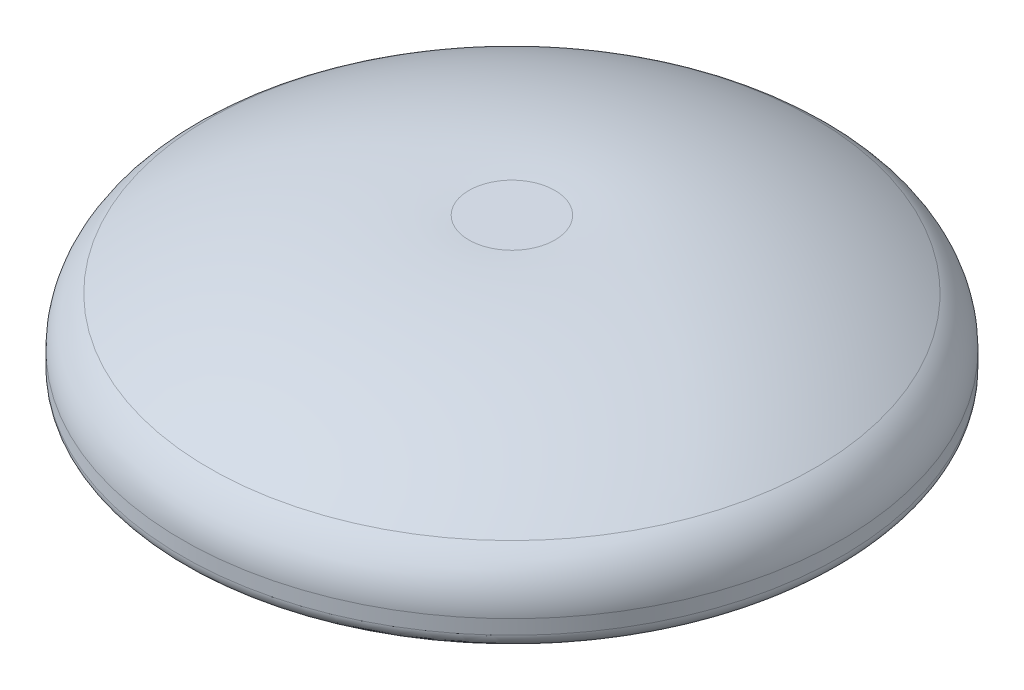
ISO-10303-21;
HEADER;
FILE_DESCRIPTION(('STEP AP214'),'2;1');
FILE_NAME('part.step','',(''),(''),'','','');
FILE_SCHEMA(('AUTOMOTIVE_DESIGN { 1 0 10303 214 1 1 1 1 }'));
ENDSEC;
DATA;
#1=APPLICATION_CONTEXT('core data for automotive mechanical design processes');
#2=APPLICATION_PROTOCOL_DEFINITION('international standard','automotive_design',2000,#1);
#3=PRODUCT_CONTEXT('',#1,'mechanical');
#4=PRODUCT('Part','Part','',(#3));
#5=PRODUCT_RELATED_PRODUCT_CATEGORY('part','',(#4));
#6=PRODUCT_DEFINITION_FORMATION('','',#4);
#7=PRODUCT_DEFINITION_CONTEXT('part definition',#1,'design');
#8=PRODUCT_DEFINITION('design','',#6,#7);
#9=PRODUCT_DEFINITION_SHAPE('','',#8);
#10=(LENGTH_UNIT() NAMED_UNIT(*) SI_UNIT(.MILLI.,.METRE.));
#11=(NAMED_UNIT(*) PLANE_ANGLE_UNIT() SI_UNIT($,.RADIAN.));
#12=(NAMED_UNIT(*) SI_UNIT($,.STERADIAN.) SOLID_ANGLE_UNIT());
#13=UNCERTAINTY_MEASURE_WITH_UNIT(LENGTH_MEASURE(1.E-05),#10,'distance_accuracy_value','');
#14=(GEOMETRIC_REPRESENTATION_CONTEXT(3) GLOBAL_UNCERTAINTY_ASSIGNED_CONTEXT((#13)) GLOBAL_UNIT_ASSIGNED_CONTEXT((#10,
#11,#12)) REPRESENTATION_CONTEXT('',''));
#15=CARTESIAN_POINT('',(0.,0.,0.));
#16=DIRECTION('',(0.,0.,1.));
#17=DIRECTION('',(1.,0.,0.));
#18=AXIS2_PLACEMENT_3D('',#15,#16,#17);
#19=CARTESIAN_POINT('',(0.,0.499985845031289,0.));
#20=DIRECTION('',(0.,-1.,0.));
#21=DIRECTION('',(0.,0.,-1.));
#22=AXIS2_PLACEMENT_3D('',#19,#20,#21);
#23=TOROIDAL_SURFACE('',#22,11.0000138738086,0.499986126383047);
#24=CARTESIAN_POINT('',(0.,-2.81351758080542E-07,0.));
#25=DIRECTION('',(0.,-1.,0.));
#26=DIRECTION('',(0.,0.,-1.));
#27=AXIS2_PLACEMENT_3D('',#24,#25,#26);
#28=CIRCLE('',#27,11.0000138738086);
#29=CARTESIAN_POINT('',(0.,-2.81351758080542E-07,-11.0000138738086));
#30=VERTEX_POINT('',#29);
#31=EDGE_CURVE('E53',#30,#30,#28,.T.);
#32=ORIENTED_EDGE('',*,*,#31,.F.);
#33=EDGE_LOOP('',(#32));
#34=FACE_BOUND('',#33,.T.);
#35=CARTESIAN_POINT('',(0.,0.499999718648242,0.));
#36=DIRECTION('',(0.,-1.,0.));
#37=DIRECTION('',(0.,0.,-1.));
#38=AXIS2_PLACEMENT_3D('',#35,#36,#37);
#39=CIRCLE('',#38,11.4999999999992);
#40=CARTESIAN_POINT('',(0.,0.499999718648242,-11.4999999999992));
#41=VERTEX_POINT('',#40);
#42=EDGE_CURVE('E65',#41,#41,#39,.T.);
#43=ORIENTED_EDGE('',*,*,#42,.T.);
#44=EDGE_LOOP('',(#43));
#45=FACE_BOUND('',#44,.T.);
#46=ADVANCED_FACE('F33',(#34,#45),#23,.T.);
#47=CARTESIAN_POINT('',(-11.0000138738086,-2.81351758080542E-07,0.));
#48=DIRECTION('',(0.,1.,0.));
#49=DIRECTION('',(0.,0.,1.));
#50=AXIS2_PLACEMENT_3D('',#47,#48,#49);
#51=PLANE('',#50);
#52=CARTESIAN_POINT('',(0.,-2.81351758080542E-07,0.));
#53=DIRECTION('',(0.,1.,0.));
#54=DIRECTION('',(0.,0.,1.));
#55=AXIS2_PLACEMENT_3D('',#52,#53,#54);
#56=CIRCLE('',#55,2.5);
#57=CARTESIAN_POINT('',(0.,-2.81351758080542E-07,2.5));
#58=VERTEX_POINT('',#57);
#59=EDGE_CURVE('E44',#58,#58,#56,.T.);
#60=ORIENTED_EDGE('',*,*,#59,.T.);
#61=EDGE_LOOP('',(#60));
#62=FACE_BOUND('',#61,.T.);
#63=ORIENTED_EDGE('',*,*,#31,.T.);
#64=EDGE_LOOP('',(#63));
#65=FACE_BOUND('',#64,.T.);
#66=ADVANCED_FACE('F99',(#62,#65),#51,.F.);
#67=CARTESIAN_POINT('',(0.,0.,0.));
#68=DIRECTION('',(0.,-1.,0.));
#69=DIRECTION('',(0.,0.,-1.));
#70=AXIS2_PLACEMENT_3D('',#67,#68,#69);
#71=CYLINDRICAL_SURFACE('',#70,1.);
#72=CARTESIAN_POINT('',(0.,-4.50000028135176,0.));
#73=DIRECTION('',(0.,1.,0.));
#74=DIRECTION('',(0.,0.,1.));
#75=AXIS2_PLACEMENT_3D('',#72,#73,#74);
#76=CIRCLE('',#75,1.);
#77=CARTESIAN_POINT('',(0.,-4.50000028135176,1.));
#78=VERTEX_POINT('',#77);
#79=EDGE_CURVE('E10',#78,#78,#76,.T.);
#80=ORIENTED_EDGE('',*,*,#79,.T.);
#81=EDGE_LOOP('',(#80));
#82=FACE_BOUND('',#81,.T.);
#83=CARTESIAN_POINT('',(0.,-1.50000028135176,0.));
#84=DIRECTION('',(0.,1.,0.));
#85=DIRECTION('',(0.,0.,1.));
#86=AXIS2_PLACEMENT_3D('',#83,#84,#85);
#87=CIRCLE('',#86,1.);
#88=CARTESIAN_POINT('',(0.,-1.50000028135176,1.));
#89=VERTEX_POINT('',#88);
#90=EDGE_CURVE('E48',#89,#89,#87,.F.);
#91=ORIENTED_EDGE('',*,*,#90,.T.);
#92=EDGE_LOOP('',(#91));
#93=FACE_BOUND('',#92,.T.);
#94=ADVANCED_FACE('F96',(#82,#93),#71,.T.);
#95=CARTESIAN_POINT('',(-0.999999999999999,-5.00000028135176,0.));
#96=DIRECTION('',(0.,1.,0.));
#97=DIRECTION('',(0.,0.,1.));
#98=AXIS2_PLACEMENT_3D('',#95,#96,#97);
#99=PLANE('',#98);
#100=CARTESIAN_POINT('',(0.,-5.00000028135176,0.));
#101=DIRECTION('',(0.,1.,0.));
#102=DIRECTION('',(0.,0.,1.));
#103=AXIS2_PLACEMENT_3D('',#100,#101,#102);
#104=CIRCLE('',#103,0.500000000000004);
#105=CARTESIAN_POINT('',(0.,-5.00000028135176,0.500000000000004));
#106=VERTEX_POINT('',#105);
#107=EDGE_CURVE('E40',#106,#106,#104,.F.);
#108=ORIENTED_EDGE('',*,*,#107,.T.);
#109=EDGE_LOOP('',(#108));
#110=FACE_BOUND('',#109,.T.);
#111=ADVANCED_FACE('F91',(#110),#99,.F.);
#112=CARTESIAN_POINT('',(-1.50000000000001,5.06243,0.));
#113=DIRECTION('',(0.,-1.,0.));
#114=DIRECTION('',(0.,0.,-1.));
#115=AXIS2_PLACEMENT_3D('',#112,#113,#114);
#116=PLANE('',#115);
#117=CARTESIAN_POINT('',(0.,5.06243,0.));
#118=DIRECTION('',(0.,-1.,0.));
#119=DIRECTION('',(0.,0.,-1.));
#120=AXIS2_PLACEMENT_3D('',#117,#118,#119);
#121=CIRCLE('',#120,1.50000000000001);
#122=CARTESIAN_POINT('',(0.,5.06243,-1.50000000000001));
#123=VERTEX_POINT('',#122);
#124=EDGE_CURVE('E56',#123,#123,#121,.T.);
#125=ORIENTED_EDGE('',*,*,#124,.F.);
#126=EDGE_LOOP('',(#125));
#127=FACE_BOUND('',#126,.T.);
#128=ADVANCED_FACE('F86',(#127),#116,.F.);
#129=CARTESIAN_POINT('',(0.,-10.4322816503441,0.));
#130=DIRECTION('',(0.,-1.,0.));
#131=DIRECTION('',(0.,0.,-1.));
#132=AXIS2_PLACEMENT_3D('',#129,#130,#131);
#133=DEGENERATE_TOROIDAL_SURFACE('',#132,2.30270713318434,15.5154899332562,.T.);
#134=CARTESIAN_POINT('',(0.,2.70028186064478,0.));
#135=DIRECTION('',(0.,-1.,0.));
#136=DIRECTION('',(0.,0.,-1.));
#137=AXIS2_PLACEMENT_3D('',#134,#135,#136);
#138=CIRCLE('',#137,10.5650435762746);
#139=CARTESIAN_POINT('',(0.,2.70028186064478,-10.5650435762746));
#140=VERTEX_POINT('',#139);
#141=EDGE_CURVE('E59',#140,#140,#138,.T.);
#142=ORIENTED_EDGE('',*,*,#141,.F.);
#143=EDGE_LOOP('',(#142));
#144=FACE_BOUND('',#143,.T.);
#145=ORIENTED_EDGE('',*,*,#124,.T.);
#146=EDGE_LOOP('',(#145));
#147=FACE_BOUND('',#146,.T.);
#148=ADVANCED_FACE('F80',(#144,#147),#133,.T.);
#149=CARTESIAN_POINT('',(0.,1.00744926979759,0.));
#150=DIRECTION('',(0.,-1.,0.));
#151=DIRECTION('',(0.,0.,-1.));
#152=AXIS2_PLACEMENT_3D('',#149,#150,#151);
#153=TOROIDAL_SURFACE('',#152,9.49999999999918,2.);
#154=CARTESIAN_POINT('',(0.,0.999999718455754,0.));
#155=DIRECTION('',(0.,-1.,0.));
#156=DIRECTION('',(0.,0.,-1.));
#157=AXIS2_PLACEMENT_3D('',#154,#155,#156);
#158=CIRCLE('',#157,11.4999861259973);
#159=CARTESIAN_POINT('',(0.,0.999999718455754,-11.4999861259973));
#160=VERTEX_POINT('',#159);
#161=EDGE_CURVE('E62',#160,#160,#158,.T.);
#162=ORIENTED_EDGE('',*,*,#161,.F.);
#163=EDGE_LOOP('',(#162));
#164=FACE_BOUND('',#163,.T.);
#165=ORIENTED_EDGE('',*,*,#141,.T.);
#166=EDGE_LOOP('',(#165));
#167=FACE_BOUND('',#166,.T.);
#168=ADVANCED_FACE('F74',(#164,#167),#153,.T.);
#169=CARTESIAN_POINT('',(0.,0.999999718455754,0.));
#170=DIRECTION('',(0.,-1.,0.));
#171=DIRECTION('',(0.,0.,-1.));
#172=AXIS2_PLACEMENT_3D('',#169,#170,#171);
#173=CONICAL_SURFACE('',#172,11.4999861259973,2.77480038391812E-05);
#174=ORIENTED_EDGE('',*,*,#42,.F.);
#175=EDGE_LOOP('',(#174));
#176=FACE_BOUND('',#175,.T.);
#177=ORIENTED_EDGE('',*,*,#161,.T.);
#178=EDGE_LOOP('',(#177));
#179=FACE_BOUND('',#178,.T.);
#180=ADVANCED_FACE('F70',(#176,#179),#173,.T.);
#181=CARTESIAN_POINT('',(0.,-1.50000028135176,0.));
#182=DIRECTION('',(0.,1.,0.));
#183=DIRECTION('',(0.,0.,1.));
#184=AXIS2_PLACEMENT_3D('',#181,#182,#183);
#185=TOROIDAL_SURFACE('',#184,2.5,1.5);
#186=ORIENTED_EDGE('',*,*,#59,.F.);
#187=EDGE_LOOP('',(#186));
#188=FACE_BOUND('',#187,.T.);
#189=ORIENTED_EDGE('',*,*,#90,.F.);
#190=EDGE_LOOP('',(#189));
#191=FACE_BOUND('',#190,.T.);
#192=ADVANCED_FACE('F73',(#188,#191),#185,.F.);
#193=CARTESIAN_POINT('',(0.,-5.00000028135176,0.));
#194=DIRECTION('',(0.,1.,0.));
#195=DIRECTION('',(0.,0.,1.));
#196=AXIS2_PLACEMENT_3D('',#193,#194,#195);
#197=CONICAL_SURFACE('',#196,0.500000000000004,0.785398163397445);
#198=ORIENTED_EDGE('',*,*,#79,.F.);
#199=EDGE_LOOP('',(#198));
#200=FACE_BOUND('',#199,.T.);
#201=ORIENTED_EDGE('',*,*,#107,.F.);
#202=EDGE_LOOP('',(#201));
#203=FACE_BOUND('',#202,.T.);
#204=ADVANCED_FACE('F35',(#200,#203),#197,.T.);
#205=CLOSED_SHELL('',(#46,#66,#94,#111,#128,#148,#168,#180,#192,#204));
#206=MANIFOLD_SOLID_BREP('B2',#205);
#207=ADVANCED_BREP_SHAPE_REPRESENTATION('',(#18,#206),#14);
#208=SHAPE_DEFINITION_REPRESENTATION(#9,#207);
ENDSEC;
END-ISO-10303-21;
